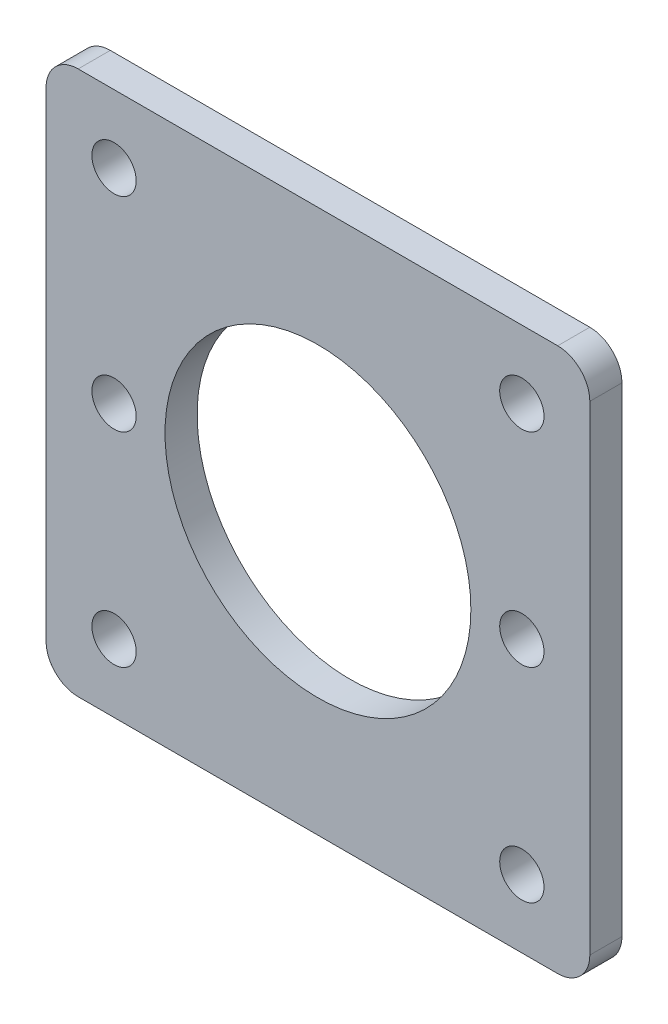
ISO-10303-21;
HEADER;
FILE_DESCRIPTION(('STEP AP214'),'2;1');
FILE_NAME('part.step','',(''),(''),'','','');
FILE_SCHEMA(('AUTOMOTIVE_DESIGN { 1 0 10303 214 1 1 1 1 }'));
ENDSEC;
DATA;
#1=APPLICATION_CONTEXT('core data for automotive mechanical design processes');
#2=APPLICATION_PROTOCOL_DEFINITION('international standard','automotive_design',2000,#1);
#3=PRODUCT_CONTEXT('',#1,'mechanical');
#4=PRODUCT('Part','Part','',(#3));
#5=PRODUCT_RELATED_PRODUCT_CATEGORY('part','',(#4));
#6=PRODUCT_DEFINITION_FORMATION('','',#4);
#7=PRODUCT_DEFINITION_CONTEXT('part definition',#1,'design');
#8=PRODUCT_DEFINITION('design','',#6,#7);
#9=PRODUCT_DEFINITION_SHAPE('','',#8);
#10=(LENGTH_UNIT() NAMED_UNIT(*) SI_UNIT(.MILLI.,.METRE.));
#11=(NAMED_UNIT(*) PLANE_ANGLE_UNIT() SI_UNIT($,.RADIAN.));
#12=(NAMED_UNIT(*) SI_UNIT($,.STERADIAN.) SOLID_ANGLE_UNIT());
#13=UNCERTAINTY_MEASURE_WITH_UNIT(LENGTH_MEASURE(1.E-05),#10,'distance_accuracy_value','');
#14=(GEOMETRIC_REPRESENTATION_CONTEXT(3) GLOBAL_UNCERTAINTY_ASSIGNED_CONTEXT((#13)) GLOBAL_UNIT_ASSIGNED_CONTEXT((#10,
#11,#12)) REPRESENTATION_CONTEXT('',''));
#15=CARTESIAN_POINT('',(0.,0.,0.));
#16=DIRECTION('',(0.,0.,1.));
#17=DIRECTION('',(1.,0.,0.));
#18=AXIS2_PLACEMENT_3D('',#15,#16,#17);
#19=CARTESIAN_POINT('',(0.,0.,1.5));
#20=DIRECTION('',(0.,0.,1.));
#21=DIRECTION('',(1.,0.,0.));
#22=AXIS2_PLACEMENT_3D('',#19,#20,#21);
#23=PLANE('',#22);
#24=CARTESIAN_POINT('',(-19.05,0.,1.5));
#25=DIRECTION('',(0.,0.,1.));
#26=DIRECTION('',(1.,0.,0.));
#27=AXIS2_PLACEMENT_3D('',#24,#25,#26);
#28=CIRCLE('',#27,2.07);
#29=CARTESIAN_POINT('',(-16.98,0.,1.5));
#30=VERTEX_POINT('',#29);
#31=EDGE_CURVE('E269',#30,#30,#28,.T.);
#32=ORIENTED_EDGE('',*,*,#31,.F.);
#33=EDGE_LOOP('',(#32));
#34=FACE_BOUND('',#33,.T.);
#35=CARTESIAN_POINT('',(19.05,19.05,1.5));
#36=DIRECTION('',(0.,0.,1.));
#37=DIRECTION('',(1.,0.,0.));
#38=AXIS2_PLACEMENT_3D('',#35,#36,#37);
#39=CIRCLE('',#38,2.07);
#40=CARTESIAN_POINT('',(21.12,19.05,1.5));
#41=VERTEX_POINT('',#40);
#42=EDGE_CURVE('E285',#41,#41,#39,.T.);
#43=ORIENTED_EDGE('',*,*,#42,.F.);
#44=EDGE_LOOP('',(#43));
#45=FACE_BOUND('',#44,.T.);
#46=CARTESIAN_POINT('',(-19.05,19.05,1.5));
#47=DIRECTION('',(0.,0.,1.));
#48=DIRECTION('',(1.,0.,0.));
#49=AXIS2_PLACEMENT_3D('',#46,#47,#48);
#50=CIRCLE('',#49,2.07);
#51=CARTESIAN_POINT('',(-16.98,19.05,1.5));
#52=VERTEX_POINT('',#51);
#53=EDGE_CURVE('E301',#52,#52,#50,.T.);
#54=ORIENTED_EDGE('',*,*,#53,.F.);
#55=EDGE_LOOP('',(#54));
#56=FACE_BOUND('',#55,.T.);
#57=DIRECTION('',(0.,-1.,0.));
#58=VECTOR('',#57,1.);
#59=CARTESIAN_POINT('',(-25.4,25.4,1.5));
#60=LINE('',#59,#58);
#61=CARTESIAN_POINT('',(-25.4,22.4,1.5));
#62=VERTEX_POINT('',#61);
#63=CARTESIAN_POINT('',(-25.4,-22.4,1.5));
#64=VERTEX_POINT('',#63);
#65=EDGE_CURVE('E181',#62,#64,#60,.T.);
#66=ORIENTED_EDGE('',*,*,#65,.T.);
#67=CARTESIAN_POINT('',(-22.4,-22.4,1.5));
#68=DIRECTION('',(0.,0.,1.));
#69=DIRECTION('',(1.,0.,0.));
#70=AXIS2_PLACEMENT_3D('',#67,#68,#69);
#71=CIRCLE('',#70,3.);
#72=CARTESIAN_POINT('',(-22.4,-25.4,1.5));
#73=VERTEX_POINT('',#72);
#74=EDGE_CURVE('E169',#64,#73,#71,.T.);
#75=ORIENTED_EDGE('',*,*,#74,.T.);
#76=DIRECTION('',(1.,0.,0.));
#77=VECTOR('',#76,1.);
#78=CARTESIAN_POINT('',(-25.4,-25.4,1.5));
#79=LINE('',#78,#77);
#80=CARTESIAN_POINT('',(22.4,-25.4,1.5));
#81=VERTEX_POINT('',#80);
#82=EDGE_CURVE('E127',#73,#81,#79,.T.);
#83=ORIENTED_EDGE('',*,*,#82,.T.);
#84=CARTESIAN_POINT('',(22.4,-22.4,1.5));
#85=DIRECTION('',(0.,0.,1.));
#86=DIRECTION('',(1.,0.,0.));
#87=AXIS2_PLACEMENT_3D('',#84,#85,#86);
#88=CIRCLE('',#87,3.);
#89=CARTESIAN_POINT('',(25.4,-22.4,1.5));
#90=VERTEX_POINT('',#89);
#91=EDGE_CURVE('E166',#81,#90,#88,.T.);
#92=ORIENTED_EDGE('',*,*,#91,.T.);
#93=DIRECTION('',(0.,1.,0.));
#94=VECTOR('',#93,1.);
#95=CARTESIAN_POINT('',(25.4,25.4,1.5));
#96=LINE('',#95,#94);
#97=CARTESIAN_POINT('',(25.4,22.4,1.5));
#98=VERTEX_POINT('',#97);
#99=EDGE_CURVE('E136',#90,#98,#96,.T.);
#100=ORIENTED_EDGE('',*,*,#99,.T.);
#101=CARTESIAN_POINT('',(22.4,22.4,1.5));
#102=DIRECTION('',(0.,0.,1.));
#103=DIRECTION('',(1.,0.,0.));
#104=AXIS2_PLACEMENT_3D('',#101,#102,#103);
#105=CIRCLE('',#104,3.);
#106=CARTESIAN_POINT('',(22.4,25.4,1.5));
#107=VERTEX_POINT('',#106);
#108=EDGE_CURVE('E61',#98,#107,#105,.T.);
#109=ORIENTED_EDGE('',*,*,#108,.T.);
#110=DIRECTION('',(-1.,0.,0.));
#111=VECTOR('',#110,1.);
#112=CARTESIAN_POINT('',(-25.4,25.4,1.5));
#113=LINE('',#112,#111);
#114=CARTESIAN_POINT('',(-22.4,25.4,1.5));
#115=VERTEX_POINT('',#114);
#116=EDGE_CURVE('E141',#107,#115,#113,.T.);
#117=ORIENTED_EDGE('',*,*,#116,.T.);
#118=CARTESIAN_POINT('',(-22.4,22.4,1.5));
#119=DIRECTION('',(0.,0.,1.));
#120=DIRECTION('',(1.,0.,0.));
#121=AXIS2_PLACEMENT_3D('',#118,#119,#120);
#122=CIRCLE('',#121,3.);
#123=EDGE_CURVE('E161',#115,#62,#122,.T.);
#124=ORIENTED_EDGE('',*,*,#123,.T.);
#125=EDGE_LOOP('',(#66,#75,#83,#92,#100,#109,#117,#124));
#126=FACE_BOUND('',#125,.T.);
#127=CARTESIAN_POINT('',(0.,0.,1.5));
#128=DIRECTION('',(0.,0.,1.));
#129=DIRECTION('',(1.,0.,0.));
#130=AXIS2_PLACEMENT_3D('',#127,#128,#129);
#131=CIRCLE('',#130,14.2875);
#132=CARTESIAN_POINT('',(14.2875,0.,1.5));
#133=VERTEX_POINT('',#132);
#134=EDGE_CURVE('E193',#133,#133,#131,.T.);
#135=ORIENTED_EDGE('',*,*,#134,.F.);
#136=EDGE_LOOP('',(#135));
#137=FACE_BOUND('',#136,.T.);
#138=CARTESIAN_POINT('',(19.05,-19.05,1.5));
#139=DIRECTION('',(0.,0.,1.));
#140=DIRECTION('',(-1.,0.,0.));
#141=AXIS2_PLACEMENT_3D('',#138,#139,#140);
#142=CIRCLE('',#141,2.07);
#143=CARTESIAN_POINT('',(16.98,-19.05,1.5));
#144=VERTEX_POINT('',#143);
#145=EDGE_CURVE('E293',#144,#144,#142,.T.);
#146=ORIENTED_EDGE('',*,*,#145,.F.);
#147=EDGE_LOOP('',(#146));
#148=FACE_BOUND('',#147,.T.);
#149=CARTESIAN_POINT('',(-19.05,-19.05,1.5));
#150=DIRECTION('',(0.,0.,1.));
#151=DIRECTION('',(1.,0.,0.));
#152=AXIS2_PLACEMENT_3D('',#149,#150,#151);
#153=CIRCLE('',#152,2.07);
#154=CARTESIAN_POINT('',(-16.98,-19.05,1.5));
#155=VERTEX_POINT('',#154);
#156=EDGE_CURVE('E277',#155,#155,#153,.T.);
#157=ORIENTED_EDGE('',*,*,#156,.F.);
#158=EDGE_LOOP('',(#157));
#159=FACE_BOUND('',#158,.T.);
#160=CARTESIAN_POINT('',(19.05,0.,1.5));
#161=DIRECTION('',(0.,0.,1.));
#162=DIRECTION('',(-1.,0.,0.));
#163=AXIS2_PLACEMENT_3D('',#160,#161,#162);
#164=CIRCLE('',#163,2.07);
#165=CARTESIAN_POINT('',(16.98,0.,1.5));
#166=VERTEX_POINT('',#165);
#167=EDGE_CURVE('E258',#166,#166,#164,.T.);
#168=ORIENTED_EDGE('',*,*,#167,.F.);
#169=EDGE_LOOP('',(#168));
#170=FACE_BOUND('',#169,.T.);
#171=ADVANCED_FACE('F39',(#34,#45,#56,#126,#137,#148,#159,#170),#23,.T.);
#172=CARTESIAN_POINT('',(0.,0.,-1.5));
#173=DIRECTION('',(0.,0.,1.));
#174=DIRECTION('',(1.,0.,0.));
#175=AXIS2_PLACEMENT_3D('',#172,#173,#174);
#176=PLANE('',#175);
#177=DIRECTION('',(1.,0.,0.));
#178=VECTOR('',#177,1.);
#179=CARTESIAN_POINT('',(-25.4,-25.4,-1.5));
#180=LINE('',#179,#178);
#181=CARTESIAN_POINT('',(-22.4,-25.4,-1.5));
#182=VERTEX_POINT('',#181);
#183=CARTESIAN_POINT('',(22.4,-25.4,-1.5));
#184=VERTEX_POINT('',#183);
#185=EDGE_CURVE('E124',#182,#184,#180,.T.);
#186=ORIENTED_EDGE('',*,*,#185,.F.);
#187=CARTESIAN_POINT('',(-22.4,-22.4,-1.5));
#188=DIRECTION('',(0.,0.,1.));
#189=DIRECTION('',(1.,0.,0.));
#190=AXIS2_PLACEMENT_3D('',#187,#188,#189);
#191=CIRCLE('',#190,3.);
#192=CARTESIAN_POINT('',(-25.4,-22.4,-1.5));
#193=VERTEX_POINT('',#192);
#194=EDGE_CURVE('E106',#182,#193,#191,.F.);
#195=ORIENTED_EDGE('',*,*,#194,.T.);
#196=DIRECTION('',(0.,-1.,0.));
#197=VECTOR('',#196,1.);
#198=CARTESIAN_POINT('',(-25.4,25.4,-1.5));
#199=LINE('',#198,#197);
#200=CARTESIAN_POINT('',(-25.4,22.4,-1.5));
#201=VERTEX_POINT('',#200);
#202=EDGE_CURVE('E137',#201,#193,#199,.T.);
#203=ORIENTED_EDGE('',*,*,#202,.F.);
#204=CARTESIAN_POINT('',(-22.4,22.4,-1.5));
#205=DIRECTION('',(0.,0.,1.));
#206=DIRECTION('',(1.,0.,0.));
#207=AXIS2_PLACEMENT_3D('',#204,#205,#206);
#208=CIRCLE('',#207,3.);
#209=CARTESIAN_POINT('',(-22.4,25.4,-1.5));
#210=VERTEX_POINT('',#209);
#211=EDGE_CURVE('E129',#201,#210,#208,.F.);
#212=ORIENTED_EDGE('',*,*,#211,.T.);
#213=DIRECTION('',(-1.,0.,0.));
#214=VECTOR('',#213,1.);
#215=CARTESIAN_POINT('',(-25.4,25.4,-1.5));
#216=LINE('',#215,#214);
#217=CARTESIAN_POINT('',(22.4,25.4,-1.5));
#218=VERTEX_POINT('',#217);
#219=EDGE_CURVE('E143',#218,#210,#216,.T.);
#220=ORIENTED_EDGE('',*,*,#219,.F.);
#221=CARTESIAN_POINT('',(22.4,22.4,-1.5));
#222=DIRECTION('',(0.,0.,1.));
#223=DIRECTION('',(1.,0.,0.));
#224=AXIS2_PLACEMENT_3D('',#221,#222,#223);
#225=CIRCLE('',#224,3.);
#226=CARTESIAN_POINT('',(25.4,22.4,-1.5));
#227=VERTEX_POINT('',#226);
#228=EDGE_CURVE('E151',#218,#227,#225,.F.);
#229=ORIENTED_EDGE('',*,*,#228,.T.);
#230=DIRECTION('',(0.,1.,0.));
#231=VECTOR('',#230,1.);
#232=CARTESIAN_POINT('',(25.4,25.4,-1.5));
#233=LINE('',#232,#231);
#234=CARTESIAN_POINT('',(25.4,-22.4,-1.5));
#235=VERTEX_POINT('',#234);
#236=EDGE_CURVE('E190',#235,#227,#233,.T.);
#237=ORIENTED_EDGE('',*,*,#236,.F.);
#238=CARTESIAN_POINT('',(22.4,-22.4,-1.5));
#239=DIRECTION('',(0.,0.,1.));
#240=DIRECTION('',(1.,0.,0.));
#241=AXIS2_PLACEMENT_3D('',#238,#239,#240);
#242=CIRCLE('',#241,3.);
#243=EDGE_CURVE('E118',#235,#184,#242,.F.);
#244=ORIENTED_EDGE('',*,*,#243,.T.);
#245=EDGE_LOOP('',(#186,#195,#203,#212,#220,#229,#237,#244));
#246=FACE_BOUND('',#245,.T.);
#247=CARTESIAN_POINT('',(0.,0.,-1.5));
#248=DIRECTION('',(0.,0.,1.));
#249=DIRECTION('',(1.,0.,0.));
#250=AXIS2_PLACEMENT_3D('',#247,#248,#249);
#251=CIRCLE('',#250,14.2875);
#252=CARTESIAN_POINT('',(14.2875,0.,-1.5));
#253=VERTEX_POINT('',#252);
#254=EDGE_CURVE('E305',#253,#253,#251,.T.);
#255=ORIENTED_EDGE('',*,*,#254,.T.);
#256=EDGE_LOOP('',(#255));
#257=FACE_BOUND('',#256,.T.);
#258=CARTESIAN_POINT('',(-19.05,19.05,-1.5));
#259=DIRECTION('',(0.,0.,1.));
#260=DIRECTION('',(1.,0.,0.));
#261=AXIS2_PLACEMENT_3D('',#258,#259,#260);
#262=CIRCLE('',#261,2.07);
#263=CARTESIAN_POINT('',(-16.98,19.05,-1.5));
#264=VERTEX_POINT('',#263);
#265=EDGE_CURVE('E297',#264,#264,#262,.T.);
#266=ORIENTED_EDGE('',*,*,#265,.T.);
#267=EDGE_LOOP('',(#266));
#268=FACE_BOUND('',#267,.T.);
#269=CARTESIAN_POINT('',(19.05,-19.05,-1.5));
#270=DIRECTION('',(0.,0.,1.));
#271=DIRECTION('',(-1.,0.,0.));
#272=AXIS2_PLACEMENT_3D('',#269,#270,#271);
#273=CIRCLE('',#272,2.07);
#274=CARTESIAN_POINT('',(16.98,-19.05,-1.5));
#275=VERTEX_POINT('',#274);
#276=EDGE_CURVE('E289',#275,#275,#273,.T.);
#277=ORIENTED_EDGE('',*,*,#276,.T.);
#278=EDGE_LOOP('',(#277));
#279=FACE_BOUND('',#278,.T.);
#280=CARTESIAN_POINT('',(19.05,19.05,-1.5));
#281=DIRECTION('',(0.,0.,1.));
#282=DIRECTION('',(1.,0.,0.));
#283=AXIS2_PLACEMENT_3D('',#280,#281,#282);
#284=CIRCLE('',#283,2.07);
#285=CARTESIAN_POINT('',(21.12,19.05,-1.5));
#286=VERTEX_POINT('',#285);
#287=EDGE_CURVE('E281',#286,#286,#284,.T.);
#288=ORIENTED_EDGE('',*,*,#287,.T.);
#289=EDGE_LOOP('',(#288));
#290=FACE_BOUND('',#289,.T.);
#291=CARTESIAN_POINT('',(-19.05,-19.05,-1.5));
#292=DIRECTION('',(0.,0.,1.));
#293=DIRECTION('',(1.,0.,0.));
#294=AXIS2_PLACEMENT_3D('',#291,#292,#293);
#295=CIRCLE('',#294,2.07);
#296=CARTESIAN_POINT('',(-16.98,-19.05,-1.5));
#297=VERTEX_POINT('',#296);
#298=EDGE_CURVE('E273',#297,#297,#295,.T.);
#299=ORIENTED_EDGE('',*,*,#298,.T.);
#300=EDGE_LOOP('',(#299));
#301=FACE_BOUND('',#300,.T.);
#302=CARTESIAN_POINT('',(-19.05,0.,-1.5));
#303=DIRECTION('',(0.,0.,1.));
#304=DIRECTION('',(1.,0.,0.));
#305=AXIS2_PLACEMENT_3D('',#302,#303,#304);
#306=CIRCLE('',#305,2.07);
#307=CARTESIAN_POINT('',(-16.98,0.,-1.5));
#308=VERTEX_POINT('',#307);
#309=EDGE_CURVE('E266',#308,#308,#306,.T.);
#310=ORIENTED_EDGE('',*,*,#309,.T.);
#311=EDGE_LOOP('',(#310));
#312=FACE_BOUND('',#311,.T.);
#313=CARTESIAN_POINT('',(19.05,0.,-1.5));
#314=DIRECTION('',(0.,0.,1.));
#315=DIRECTION('',(-1.,0.,0.));
#316=AXIS2_PLACEMENT_3D('',#313,#314,#315);
#317=CIRCLE('',#316,2.07);
#318=CARTESIAN_POINT('',(16.98,0.,-1.5));
#319=VERTEX_POINT('',#318);
#320=EDGE_CURVE('E261',#319,#319,#317,.T.);
#321=ORIENTED_EDGE('',*,*,#320,.T.);
#322=EDGE_LOOP('',(#321));
#323=FACE_BOUND('',#322,.T.);
#324=ADVANCED_FACE('F132',(#246,#257,#268,#279,#290,#301,#312,#323),#176,.F.);
#325=CARTESIAN_POINT('',(25.4,25.4,1.5));
#326=DIRECTION('',(-1.,0.,0.));
#327=DIRECTION('',(0.,-1.,0.));
#328=AXIS2_PLACEMENT_3D('',#325,#326,#327);
#329=PLANE('',#328);
#330=ORIENTED_EDGE('',*,*,#99,.F.);
#331=DIRECTION('',(0.,0.,-1.));
#332=VECTOR('',#331,1.);
#333=CARTESIAN_POINT('',(25.4,-22.4,1.5));
#334=LINE('',#333,#332);
#335=EDGE_CURVE('E175',#90,#235,#334,.T.);
#336=ORIENTED_EDGE('',*,*,#335,.T.);
#337=ORIENTED_EDGE('',*,*,#236,.T.);
#338=DIRECTION('',(0.,0.,-1.));
#339=VECTOR('',#338,1.);
#340=CARTESIAN_POINT('',(25.4,22.4,1.5));
#341=LINE('',#340,#339);
#342=EDGE_CURVE('E172',#227,#98,#341,.F.);
#343=ORIENTED_EDGE('',*,*,#342,.T.);
#344=EDGE_LOOP('',(#330,#336,#337,#343));
#345=FACE_BOUND('',#344,.T.);
#346=ADVANCED_FACE('F212',(#345),#329,.F.);
#347=CARTESIAN_POINT('',(-25.4,25.4,1.5));
#348=DIRECTION('',(0.,-1.,0.));
#349=DIRECTION('',(0.,0.,-1.));
#350=AXIS2_PLACEMENT_3D('',#347,#348,#349);
#351=PLANE('',#350);
#352=ORIENTED_EDGE('',*,*,#116,.F.);
#353=DIRECTION('',(0.,0.,-1.));
#354=VECTOR('',#353,1.);
#355=CARTESIAN_POINT('',(22.4,25.4,1.5));
#356=LINE('',#355,#354);
#357=EDGE_CURVE('E11',#107,#218,#356,.T.);
#358=ORIENTED_EDGE('',*,*,#357,.T.);
#359=ORIENTED_EDGE('',*,*,#219,.T.);
#360=DIRECTION('',(0.,0.,-1.));
#361=VECTOR('',#360,1.);
#362=CARTESIAN_POINT('',(-22.4,25.4,1.5));
#363=LINE('',#362,#361);
#364=EDGE_CURVE('E48',#210,#115,#363,.F.);
#365=ORIENTED_EDGE('',*,*,#364,.T.);
#366=EDGE_LOOP('',(#352,#358,#359,#365));
#367=FACE_BOUND('',#366,.T.);
#368=ADVANCED_FACE('F196',(#367),#351,.F.);
#369=CARTESIAN_POINT('',(-25.4,25.4,1.5));
#370=DIRECTION('',(1.,0.,0.));
#371=DIRECTION('',(0.,1.,0.));
#372=AXIS2_PLACEMENT_3D('',#369,#370,#371);
#373=PLANE('',#372);
#374=ORIENTED_EDGE('',*,*,#202,.T.);
#375=DIRECTION('',(0.,0.,-1.));
#376=VECTOR('',#375,1.);
#377=CARTESIAN_POINT('',(-25.4,-22.4,1.5));
#378=LINE('',#377,#376);
#379=EDGE_CURVE('E111',#193,#64,#378,.F.);
#380=ORIENTED_EDGE('',*,*,#379,.T.);
#381=ORIENTED_EDGE('',*,*,#65,.F.);
#382=DIRECTION('',(0.,0.,-1.));
#383=VECTOR('',#382,1.);
#384=CARTESIAN_POINT('',(-25.4,22.4,1.5));
#385=LINE('',#384,#383);
#386=EDGE_CURVE('E117',#62,#201,#385,.T.);
#387=ORIENTED_EDGE('',*,*,#386,.T.);
#388=EDGE_LOOP('',(#374,#380,#381,#387));
#389=FACE_BOUND('',#388,.T.);
#390=ADVANCED_FACE('F203',(#389),#373,.F.);
#391=CARTESIAN_POINT('',(-25.4,-25.4,1.5));
#392=DIRECTION('',(0.,1.,0.));
#393=DIRECTION('',(0.,0.,1.));
#394=AXIS2_PLACEMENT_3D('',#391,#392,#393);
#395=PLANE('',#394);
#396=ORIENTED_EDGE('',*,*,#82,.F.);
#397=DIRECTION('',(0.,0.,-1.));
#398=VECTOR('',#397,1.);
#399=CARTESIAN_POINT('',(-22.4,-25.4,1.5));
#400=LINE('',#399,#398);
#401=EDGE_CURVE('E110',#73,#182,#400,.T.);
#402=ORIENTED_EDGE('',*,*,#401,.T.);
#403=ORIENTED_EDGE('',*,*,#185,.T.);
#404=DIRECTION('',(0.,0.,-1.));
#405=VECTOR('',#404,1.);
#406=CARTESIAN_POINT('',(22.4,-25.4,1.5));
#407=LINE('',#406,#405);
#408=EDGE_CURVE('E130',#184,#81,#407,.F.);
#409=ORIENTED_EDGE('',*,*,#408,.T.);
#410=EDGE_LOOP('',(#396,#402,#403,#409));
#411=FACE_BOUND('',#410,.T.);
#412=ADVANCED_FACE('F123',(#411),#395,.F.);
#413=CARTESIAN_POINT('',(0.,0.,1.5));
#414=DIRECTION('',(0.,0.,-1.));
#415=DIRECTION('',(-1.,0.,0.));
#416=AXIS2_PLACEMENT_3D('',#413,#414,#415);
#417=CYLINDRICAL_SURFACE('',#416,14.2875);
#418=ORIENTED_EDGE('',*,*,#134,.T.);
#419=EDGE_LOOP('',(#418));
#420=FACE_BOUND('',#419,.T.);
#421=ORIENTED_EDGE('',*,*,#254,.F.);
#422=EDGE_LOOP('',(#421));
#423=FACE_BOUND('',#422,.T.);
#424=ADVANCED_FACE('F210',(#420,#423),#417,.F.);
#425=CARTESIAN_POINT('',(-19.05,19.05,1.5));
#426=DIRECTION('',(0.,0.,-1.));
#427=DIRECTION('',(-1.,0.,0.));
#428=AXIS2_PLACEMENT_3D('',#425,#426,#427);
#429=CYLINDRICAL_SURFACE('',#428,2.07);
#430=ORIENTED_EDGE('',*,*,#53,.T.);
#431=EDGE_LOOP('',(#430));
#432=FACE_BOUND('',#431,.T.);
#433=ORIENTED_EDGE('',*,*,#265,.F.);
#434=EDGE_LOOP('',(#433));
#435=FACE_BOUND('',#434,.T.);
#436=ADVANCED_FACE('F226',(#432,#435),#429,.F.);
#437=CARTESIAN_POINT('',(19.05,-19.05,1.5));
#438=DIRECTION('',(0.,0.,-1.));
#439=DIRECTION('',(-1.,0.,0.));
#440=AXIS2_PLACEMENT_3D('',#437,#438,#439);
#441=CYLINDRICAL_SURFACE('',#440,2.07);
#442=ORIENTED_EDGE('',*,*,#145,.T.);
#443=EDGE_LOOP('',(#442));
#444=FACE_BOUND('',#443,.T.);
#445=ORIENTED_EDGE('',*,*,#276,.F.);
#446=EDGE_LOOP('',(#445));
#447=FACE_BOUND('',#446,.T.);
#448=ADVANCED_FACE('F230',(#444,#447),#441,.F.);
#449=CARTESIAN_POINT('',(19.05,19.05,1.5));
#450=DIRECTION('',(0.,0.,-1.));
#451=DIRECTION('',(-1.,0.,0.));
#452=AXIS2_PLACEMENT_3D('',#449,#450,#451);
#453=CYLINDRICAL_SURFACE('',#452,2.07);
#454=ORIENTED_EDGE('',*,*,#42,.T.);
#455=EDGE_LOOP('',(#454));
#456=FACE_BOUND('',#455,.T.);
#457=ORIENTED_EDGE('',*,*,#287,.F.);
#458=EDGE_LOOP('',(#457));
#459=FACE_BOUND('',#458,.T.);
#460=ADVANCED_FACE('F234',(#456,#459),#453,.F.);
#461=CARTESIAN_POINT('',(-19.05,-19.05,1.5));
#462=DIRECTION('',(0.,0.,-1.));
#463=DIRECTION('',(-1.,0.,0.));
#464=AXIS2_PLACEMENT_3D('',#461,#462,#463);
#465=CYLINDRICAL_SURFACE('',#464,2.07);
#466=ORIENTED_EDGE('',*,*,#156,.T.);
#467=EDGE_LOOP('',(#466));
#468=FACE_BOUND('',#467,.T.);
#469=ORIENTED_EDGE('',*,*,#298,.F.);
#470=EDGE_LOOP('',(#469));
#471=FACE_BOUND('',#470,.T.);
#472=ADVANCED_FACE('F238',(#468,#471),#465,.F.);
#473=CARTESIAN_POINT('',(-19.05,0.,1.5));
#474=DIRECTION('',(0.,0.,-1.));
#475=DIRECTION('',(-1.,0.,0.));
#476=AXIS2_PLACEMENT_3D('',#473,#474,#475);
#477=CYLINDRICAL_SURFACE('',#476,2.07);
#478=ORIENTED_EDGE('',*,*,#31,.T.);
#479=EDGE_LOOP('',(#478));
#480=FACE_BOUND('',#479,.T.);
#481=ORIENTED_EDGE('',*,*,#309,.F.);
#482=EDGE_LOOP('',(#481));
#483=FACE_BOUND('',#482,.T.);
#484=ADVANCED_FACE('F242',(#480,#483),#477,.F.);
#485=CARTESIAN_POINT('',(19.05,0.,1.5));
#486=DIRECTION('',(0.,0.,-1.));
#487=DIRECTION('',(-1.,0.,0.));
#488=AXIS2_PLACEMENT_3D('',#485,#486,#487);
#489=CYLINDRICAL_SURFACE('',#488,2.07);
#490=ORIENTED_EDGE('',*,*,#167,.T.);
#491=EDGE_LOOP('',(#490));
#492=FACE_BOUND('',#491,.T.);
#493=ORIENTED_EDGE('',*,*,#320,.F.);
#494=EDGE_LOOP('',(#493));
#495=FACE_BOUND('',#494,.T.);
#496=ADVANCED_FACE('F246',(#492,#495),#489,.F.);
#497=CARTESIAN_POINT('',(-22.4,-22.4,1.5));
#498=DIRECTION('',(0.,0.,-1.));
#499=DIRECTION('',(-1.,0.,0.));
#500=AXIS2_PLACEMENT_3D('',#497,#498,#499);
#501=CYLINDRICAL_SURFACE('',#500,3.);
#502=ORIENTED_EDGE('',*,*,#74,.F.);
#503=ORIENTED_EDGE('',*,*,#379,.F.);
#504=ORIENTED_EDGE('',*,*,#194,.F.);
#505=ORIENTED_EDGE('',*,*,#401,.F.);
#506=EDGE_LOOP('',(#502,#503,#504,#505));
#507=FACE_BOUND('',#506,.T.);
#508=ADVANCED_FACE('F109',(#507),#501,.T.);
#509=CARTESIAN_POINT('',(22.4,-22.4,1.5));
#510=DIRECTION('',(0.,0.,-1.));
#511=DIRECTION('',(-1.,0.,0.));
#512=AXIS2_PLACEMENT_3D('',#509,#510,#511);
#513=CYLINDRICAL_SURFACE('',#512,3.);
#514=ORIENTED_EDGE('',*,*,#91,.F.);
#515=ORIENTED_EDGE('',*,*,#408,.F.);
#516=ORIENTED_EDGE('',*,*,#243,.F.);
#517=ORIENTED_EDGE('',*,*,#335,.F.);
#518=EDGE_LOOP('',(#514,#515,#516,#517));
#519=FACE_BOUND('',#518,.T.);
#520=ADVANCED_FACE('F253',(#519),#513,.T.);
#521=CARTESIAN_POINT('',(22.4,22.4,1.5));
#522=DIRECTION('',(0.,0.,-1.));
#523=DIRECTION('',(-1.,0.,0.));
#524=AXIS2_PLACEMENT_3D('',#521,#522,#523);
#525=CYLINDRICAL_SURFACE('',#524,3.);
#526=ORIENTED_EDGE('',*,*,#108,.F.);
#527=ORIENTED_EDGE('',*,*,#342,.F.);
#528=ORIENTED_EDGE('',*,*,#228,.F.);
#529=ORIENTED_EDGE('',*,*,#357,.F.);
#530=EDGE_LOOP('',(#526,#527,#528,#529));
#531=FACE_BOUND('',#530,.T.);
#532=ADVANCED_FACE('F342',(#531),#525,.T.);
#533=CARTESIAN_POINT('',(-22.4,22.4,1.5));
#534=DIRECTION('',(0.,0.,-1.));
#535=DIRECTION('',(-1.,0.,0.));
#536=AXIS2_PLACEMENT_3D('',#533,#534,#535);
#537=CYLINDRICAL_SURFACE('',#536,3.);
#538=ORIENTED_EDGE('',*,*,#123,.F.);
#539=ORIENTED_EDGE('',*,*,#364,.F.);
#540=ORIENTED_EDGE('',*,*,#211,.F.);
#541=ORIENTED_EDGE('',*,*,#386,.F.);
#542=EDGE_LOOP('',(#538,#539,#540,#541));
#543=FACE_BOUND('',#542,.T.);
#544=ADVANCED_FACE('F41',(#543),#537,.T.);
#545=CLOSED_SHELL('',(#171,#324,#346,#368,#390,#412,#424,#436,#448,#460,#472,#484,#496,#508,
#520,#532,#544));
#546=MANIFOLD_SOLID_BREP('B2',#545);
#547=ADVANCED_BREP_SHAPE_REPRESENTATION('',(#18,#546),#14);
#548=SHAPE_DEFINITION_REPRESENTATION(#9,#547);
ENDSEC;
END-ISO-10303-21;
